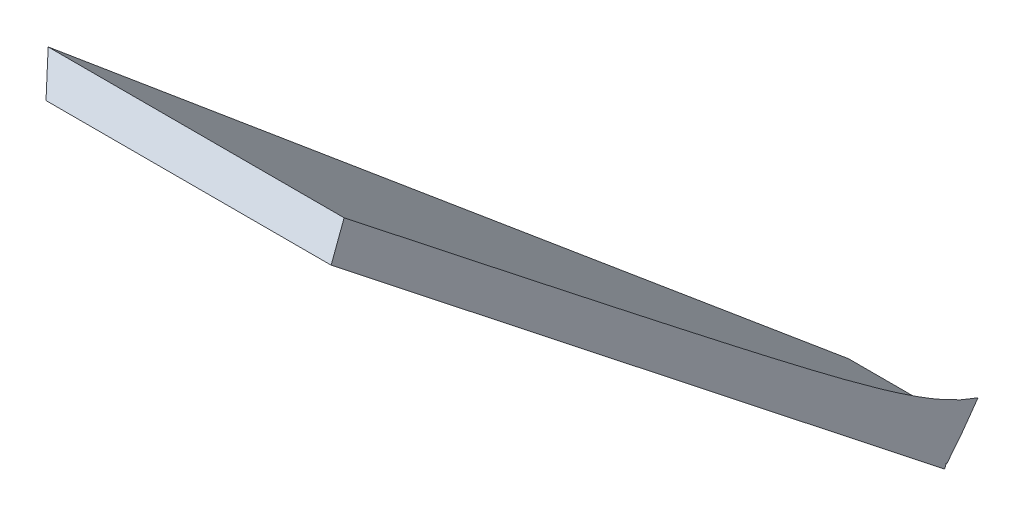
ISO-10303-21;
HEADER;
FILE_DESCRIPTION(('STEP AP214'),'2;1');
FILE_NAME('part.step','',(''),(''),'','','');
FILE_SCHEMA(('AUTOMOTIVE_DESIGN { 1 0 10303 214 1 1 1 1 }'));
ENDSEC;
DATA;
#1=APPLICATION_CONTEXT('core data for automotive mechanical design processes');
#2=APPLICATION_PROTOCOL_DEFINITION('international standard','automotive_design',2000,#1);
#3=PRODUCT_CONTEXT('',#1,'mechanical');
#4=PRODUCT('Part','Part','',(#3));
#5=PRODUCT_RELATED_PRODUCT_CATEGORY('part','',(#4));
#6=PRODUCT_DEFINITION_FORMATION('','',#4);
#7=PRODUCT_DEFINITION_CONTEXT('part definition',#1,'design');
#8=PRODUCT_DEFINITION('design','',#6,#7);
#9=PRODUCT_DEFINITION_SHAPE('','',#8);
#10=(LENGTH_UNIT() NAMED_UNIT(*) SI_UNIT(.MILLI.,.METRE.));
#11=(NAMED_UNIT(*) PLANE_ANGLE_UNIT() SI_UNIT($,.RADIAN.));
#12=(NAMED_UNIT(*) SI_UNIT($,.STERADIAN.) SOLID_ANGLE_UNIT());
#13=UNCERTAINTY_MEASURE_WITH_UNIT(LENGTH_MEASURE(1.E-05),#10,'distance_accuracy_value','');
#14=(GEOMETRIC_REPRESENTATION_CONTEXT(3) GLOBAL_UNCERTAINTY_ASSIGNED_CONTEXT((#13)) GLOBAL_UNIT_ASSIGNED_CONTEXT((#10,
#11,#12)) REPRESENTATION_CONTEXT('',''));
#15=CARTESIAN_POINT('',(0.,0.,0.));
#16=DIRECTION('',(0.,0.,1.));
#17=DIRECTION('',(1.,0.,0.));
#18=AXIS2_PLACEMENT_3D('',#15,#16,#17);
#19=CARTESIAN_POINT('',(-123.381202334399,324.271488093634,69.1234463208217));
#20=DIRECTION('',(0.843459103537485,0.255501074852039,-0.472541999624579));
#21=DIRECTION('',(-0.488764700454802,0.,-0.872415650701733));
#22=AXIS2_PLACEMENT_3D('',#19,#20,#21);
#23=PLANE('',#22);
#24=DIRECTION('',(-0.51330997527697,0.642705823376129,-0.568719697108839));
#25=VECTOR('',#24,1.);
#26=CARTESIAN_POINT('',(65.0027706220085,482.587615000697,490.978260708074));
#27=LINE('',#26,#25);
#28=CARTESIAN_POINT('',(161.595082833736,361.646186737307,597.997319736598));
#29=VERTEX_POINT('',#28);
#30=CARTESIAN_POINT('',(154.948455822144,369.968304155451,590.633216401593));
#31=VERTEX_POINT('',#30);
#32=EDGE_CURVE('E253',#29,#31,#27,.T.);
#33=ORIENTED_EDGE('',*,*,#32,.T.);
#34=DIRECTION('',(-0.213764834318812,-0.647368565890785,-0.731586314459996));
#35=VECTOR('',#34,1.);
#36=CARTESIAN_POINT('',(54.3487611073639,65.3107101967116,246.341976325958));
#37=LINE('',#36,#35);
#38=CARTESIAN_POINT('',(45.9145113102629,39.7683041554508,217.476696664976));
#39=VERTEX_POINT('',#38);
#40=EDGE_CURVE('E112',#31,#39,#37,.T.);
#41=ORIENTED_EDGE('',*,*,#40,.T.);
#42=DIRECTION('',(-0.51330997527697,0.642705823376129,-0.568719697108839));
#43=VECTOR('',#42,1.);
#44=CARTESIAN_POINT('',(29.5096667577666,60.3085033202547,199.301015937206));
#45=LINE('',#44,#43);
#46=CARTESIAN_POINT('',(52.5611383218553,31.4461867373069,224.84079999998));
#47=VERTEX_POINT('',#46);
#48=EDGE_CURVE('E260',#39,#47,#45,.F.);
#49=ORIENTED_EDGE('',*,*,#48,.T.);
#50=DIRECTION('',(-0.213764834318812,-0.647368565890785,-0.731586314459996));
#51=VECTOR('',#50,1.);
#52=CARTESIAN_POINT('',(60.6916678098232,56.0688017306996,252.666630762394));
#53=LINE('',#52,#51);
#54=EDGE_CURVE('E102',#29,#47,#53,.T.);
#55=ORIENTED_EDGE('',*,*,#54,.F.);
#56=EDGE_LOOP('',(#33,#41,#49,#55));
#57=FACE_BOUND('',#56,.T.);
#58=ADVANCED_FACE('F38',(#57),#23,.F.);
#59=CARTESIAN_POINT('',(-6.22609191666298,361.769121183095,2.73946802342179));
#60=DIRECTION('',(-0.915166256682498,0.0180699960866787,0.402671327351691));
#61=DIRECTION('',(0.402737084534614,0.,0.915315705503057));
#62=AXIS2_PLACEMENT_3D('',#59,#60,#61);
#63=PLANE('',#62);
#64=CARTESIAN_POINT('',(252.607877841035,369.968304155451,590.633216401593));
#65=DIRECTION('',(0.266763291800914,-0.721758487280029,0.638672085022341));
#66=VECTOR('',#65,1.);
#67=LINE('',#64,#66);
#68=CARTESIAN_POINT('',(252.607877841036,369.968304155451,590.633216401594));
#69=VERTEX_POINT('',#68);
#70=CARTESIAN_POINT('',(255.683748074746,361.646186737307,597.997319736598));
#71=VERTEX_POINT('',#70);
#72=EDGE_CURVE('E93',#69,#71,#67,.T.);
#73=ORIENTED_EDGE('',*,*,#72,.T.);
#74=DIRECTION('',(0.324104895832751,0.626915411174135,0.708472359185315));
#75=VECTOR('',#74,1.);
#76=CARTESIAN_POINT('',(91.5139467042197,44.0928888900743,239.132742342416));
#77=LINE('',#76,#75);
#78=CARTESIAN_POINT('',(84.9758109194033,31.4461867373069,224.84079999998));
#79=VERTEX_POINT('',#78);
#80=EDGE_CURVE('E255',#79,#71,#77,.T.);
#81=ORIENTED_EDGE('',*,*,#80,.F.);
#82=DIRECTION('',(0.266763291800911,-0.72175848728003,0.638672085022341));
#83=VECTOR('',#82,1.);
#84=CARTESIAN_POINT('',(76.4433510153192,54.5317293978966,204.412787133135));
#85=LINE('',#84,#83);
#86=CARTESIAN_POINT('',(84.572881591908,32.5362916286557,223.876128621561));
#87=VERTEX_POINT('',#86);
#88=EDGE_CURVE('E256',#79,#87,#85,.F.);
#89=ORIENTED_EDGE('',*,*,#88,.T.);
#90=CARTESIAN_POINT('',(85.0549295765274,33.7628232981962,224.916656187421));
#91=CARTESIAN_POINT('',(84.9568443758374,33.5143924299296,224.704882675522));
#92=CARTESIAN_POINT('',(84.8588871393099,33.265651210357,224.493413919692));
#93=CARTESIAN_POINT('',(84.66323548451,32.7675350057807,224.071102165369));
#94=CARTESIAN_POINT('',(84.565541066249,32.5181600207494,223.860259166903));
#95=CARTESIAN_POINT('',(84.2923974661289,31.8190638295863,223.270847593496));
#96=CARTESIAN_POINT('',(84.1172502516846,31.3686184764036,222.892997807561));
#97=CARTESIAN_POINT('',(83.9425599584571,30.9170875281886,222.516235200046));
#98=B_SPLINE_CURVE_WITH_KNOTS('',3,(#90,#91,#92,#93,#94,#95,#96,#97),.UNSPECIFIED.,.F.,.F.,(4,2,
2,4),(0.,1.02258449270982,2.04516902976666,3.88557836153574),.UNSPECIFIED.);
#99=CARTESIAN_POINT('',(84.3974829496179,32.0879287974742,223.497639591484));
#100=VERTEX_POINT('',#99);
#101=EDGE_CURVE('E265',#87,#100,#98,.T.);
#102=ORIENTED_EDGE('',*,*,#101,.T.);
#103=CARTESIAN_POINT('',(84.9822125687129,31.7704022715625,224.84079999998));
#104=CARTESIAN_POINT('',(84.2652422762924,32.1500654593654,223.194277176154));
#105=CARTESIAN_POINT('',(83.5517346550368,32.5634638073492,221.55411021981));
#106=CARTESIAN_POINT('',(82.1332336715688,33.4546729153,218.290236457361));
#107=CARTESIAN_POINT('',(81.4282307590856,33.9324022968673,216.666511597876));
#108=CARTESIAN_POINT('',(80.0229304469749,34.952791635781,213.426842495807));
#109=CARTESIAN_POINT('',(79.322675767781,35.4957722536853,211.810980955821));
#110=CARTESIAN_POINT('',(77.9302247318506,36.6427119152553,208.594835903031));
#111=CARTESIAN_POINT('',(77.2380396541252,37.2467470134385,206.994574611491));
#112=CARTESIAN_POINT('',(76.5506089116107,37.8796284871126,205.403824186521));
#113=B_SPLINE_CURVE_WITH_KNOTS('',3,(#103,#104,#105,#106,#107,#108,#109,#110,#111,#112),
.UNSPECIFIED.,.F.,.F.,(4,2,2,2,4),(0.,5.50620403271491,11.0055070580052,16.5330342474946,
22.0675338861274),.UNSPECIFIED.);
#114=CARTESIAN_POINT('',(76.5509766514666,37.8798220677374,205.404651276164));
#115=VERTEX_POINT('',#114);
#116=EDGE_CURVE('E97',#100,#115,#113,.T.);
#117=ORIENTED_EDGE('',*,*,#116,.T.);
#118=CARTESIAN_POINT('',(252.660470814629,370.070034632494,590.748181243401));
#119=CARTESIAN_POINT('',(250.455464817295,365.804896416015,585.928180608077));
#120=CARTESIAN_POINT('',(248.250426734534,361.5398624806,581.108102371354));
#121=CARTESIAN_POINT('',(243.840276059448,353.010036761755,571.467765690579));
#122=CARTESIAN_POINT('',(241.635163467122,348.745244978327,566.647507246526));
#123=CARTESIAN_POINT('',(237.224853449786,340.215937183471,557.006785180638));
#124=CARTESIAN_POINT('',(235.019656024775,335.951421172043,552.186321558804));
#125=CARTESIAN_POINT('',(230.609163515494,327.422706681706,542.545158111897));
#126=CARTESIAN_POINT('',(228.403868431223,323.158508202795,537.724458286826));
#127=CARTESIAN_POINT('',(223.993057843438,314.630270627772,528.082550529233));
#128=CARTESIAN_POINT('',(221.787542334418,310.366231549558,523.261342583399));
#129=CARTESIAN_POINT('',(217.376379866612,301.838580881307,513.618608757244));
#130=CARTESIAN_POINT('',(215.170732907825,297.57496929127,508.797082876923));
#131=CARTESIAN_POINT('',(210.759284973051,289.048247023974,499.153658596994));
#132=CARTESIAN_POINT('',(208.553483997063,284.785136346718,494.331760197384));
#133=CARTESIAN_POINT('',(204.14170026075,276.259506242119,484.687523717552));
#134=CARTESIAN_POINT('',(201.935717500422,271.996986814784,479.865185637322));
#135=CARTESIAN_POINT('',(197.523536371471,263.472652681133,470.219987831226));
#136=CARTESIAN_POINT('',(195.317338002907,259.210837974629,465.397128105499));
#137=CARTESIAN_POINT('',(190.904681863129,250.688053061476,455.750781202714));
#138=CARTESIAN_POINT('',(188.698224091917,246.427082854824,450.927294025659));
#139=CARTESIAN_POINT('',(184.284994366416,237.906165891374,441.279559688248));
#140=CARTESIAN_POINT('',(182.078222412136,233.646219134551,436.455312527911));
#141=CARTESIAN_POINT('',(177.66429390801,225.127578917922,426.805887880367));
#142=CARTESIAN_POINT('',(175.457137358173,220.868885458088,421.980710393181));
#143=CARTESIAN_POINT('',(171.042451427878,212.353250990596,412.32942943083));
#144=CARTESIAN_POINT('',(168.834922069754,208.096309910131,407.503326009693));
#145=CARTESIAN_POINT('',(164.419266004762,199.584376235877,397.84967411156));
#146=CARTESIAN_POINT('',(162.211139297886,195.329383642115,393.022125634544));
#147=CARTESIAN_POINT('',(157.794125255452,186.821880400319,383.365188593073));
#148=CARTESIAN_POINT('',(155.585237919789,182.569369752632,378.53580002836));
#149=CARTESIAN_POINT('',(151.166480456179,174.067555682236,368.874645344802));
#150=CARTESIAN_POINT('',(148.956610327799,169.818252260941,364.04287922491));
#151=CARTESIAN_POINT('',(145.640863267244,163.447540978023,356.792943857616));
#152=CARTESIAN_POINT('',(144.535472682387,161.324540759327,354.375951407537));
#153=CARTESIAN_POINT('',(142.324315083726,157.079775172932,349.541055568862));
#154=CARTESIAN_POINT('',(141.21854807001,154.958009804948,347.123152180477));
#155=CARTESIAN_POINT('',(139.006577448112,150.715916113335,342.286288651264));
#156=CARTESIAN_POINT('',(137.900373840295,148.59558778851,339.867328511319));
#157=CARTESIAN_POINT('',(135.687456260481,144.356614959386,335.028172745629));
#158=CARTESIAN_POINT('',(134.580742289148,142.237970452903,332.607977121494));
#159=CARTESIAN_POINT('',(132.366590317655,138.002429424244,327.765861904381));
#160=CARTESIAN_POINT('',(131.259152251228,135.885533120048,325.343942151015));
#161=CARTESIAN_POINT('',(129.043562153696,131.654090647833,320.49837452687));
#162=CARTESIAN_POINT('',(127.935410122283,129.53954448083,318.074726655344));
#163=CARTESIAN_POINT('',(125.71825172545,125.313256536575,313.225363387462));
#164=CARTESIAN_POINT('',(124.609245357572,123.201514767438,310.799647985157));
#165=CARTESIAN_POINT('',(122.390203452442,118.98140333445,305.945726824408));
#166=CARTESIAN_POINT('',(121.280167909088,116.873033690798,303.517521051187));
#167=CARTESIAN_POINT('',(119.283913166284,113.087219948977,299.150447407224));
#168=CARTESIAN_POINT('',(118.397919705713,111.409026257041,297.212126219958));
#169=CARTESIAN_POINT('',(116.625009807793,108.05572132754,293.333247835361));
#170=CARTESIAN_POINT('',(115.738093372244,106.38061008398,291.392690642391));
#171=CARTESIAN_POINT('',(113.963180037928,103.034045919622,287.508956478766));
#172=CARTESIAN_POINT('',(113.075183150484,101.362592960989,285.565779535544));
#173=CARTESIAN_POINT('',(111.297912961266,98.0240495115435,281.676328927243));
#174=CARTESIAN_POINT('',(110.408639681858,96.3569589457017,279.730055316362));
#175=CARTESIAN_POINT('',(108.628814593227,93.0284598252007,275.834347349901));
#176=CARTESIAN_POINT('',(107.738263237114,91.367049743198,273.884914092657));
#177=CARTESIAN_POINT('',(105.955309313905,88.0504818829457,269.981559687411));
#178=CARTESIAN_POINT('',(105.062906737537,86.3953241361295,268.027638516924));
#179=CARTESIAN_POINT('',(103.275840028819,83.0925588357623,264.114317435509));
#180=CARTESIAN_POINT('',(102.381175815363,81.4449515591164,262.154917327823));
#181=CARTESIAN_POINT('',(100.58907387438,78.1589271206093,258.229401233657));
#182=CARTESIAN_POINT('',(99.6916359428656,76.5205106608704,256.26328475206));
#183=CARTESIAN_POINT('',(98.1918842520484,73.7971139324413,252.976955970429));
#184=CARTESIAN_POINT('',(97.5904860930799,72.7089459078139,251.658967641181));
#185=CARTESIAN_POINT('',(96.3859858307554,70.5385427193834,249.018852125346));
#186=CARTESIAN_POINT('',(95.7828837024745,69.4563076430533,247.696724878186));
#187=CARTESIAN_POINT('',(94.5747545600541,67.2987724446748,245.047784415299));
#188=CARTESIAN_POINT('',(93.9697276143728,66.2234720800145,243.720971366047));
#189=CARTESIAN_POINT('',(92.7574804430895,64.0809775431069,241.061996750046));
#190=CARTESIAN_POINT('',(92.1502603869884,63.0137827633742,239.729835595788));
#191=CARTESIAN_POINT('',(90.9333037335963,60.8888672075956,237.059368700804));
#192=CARTESIAN_POINT('',(90.3235674009036,59.8311454707194,235.721063604556));
#193=CARTESIAN_POINT('',(89.1011898196953,57.726776694878,233.037354320337));
#194=CARTESIAN_POINT('',(88.4885488976155,56.6801284522175,231.691950928284));
#195=CARTESIAN_POINT('',(87.2591905743576,54.5985826947396,228.99135205953));
#196=CARTESIAN_POINT('',(86.6424695356724,53.5636988358729,227.636147702916));
#197=CARTESIAN_POINT('',(85.405086980354,51.5090918874845,224.916102973331));
#198=CARTESIAN_POINT('',(84.7844255221005,50.489368574094,223.551262743089));
#199=CARTESIAN_POINT('',(83.538527449556,48.467678623066,220.810387317432));
#200=CARTESIAN_POINT('',(82.9132905356514,47.4657131632317,219.434351388219));
#201=CARTESIAN_POINT('',(81.6575055312566,45.4825564222407,216.669276371719));
#202=CARTESIAN_POINT('',(81.0269563578638,44.5013695273999,215.280234626441));
#203=CARTESIAN_POINT('',(79.7596924500353,42.5632241829026,212.487051174908));
#204=CARTESIAN_POINT('',(79.1229751225894,41.6062765937276,211.082903088053));
#205=CARTESIAN_POINT('',(78.162694286581,40.1921857500359,208.963894496968));
#206=CARTESIAN_POINT('',(77.8416042831691,39.7241950952155,208.255142401167));
#207=CARTESIAN_POINT('',(77.1976724718567,38.7960381674455,206.833305696204));
#208=CARTESIAN_POINT('',(76.8748306344671,38.3358720267508,206.120221014085));
#209=CARTESIAN_POINT('',(76.5510686541073,37.8799147545906,205.40485621423));
#210=B_SPLINE_CURVE_WITH_KNOTS('',3,(#118,#119,#120,#121,#122,#123,#124,#125,#126,#127,#128,
#129,#130,#131,#132,#133,#134,#135,#136,#137,#138,#139,#140,#141,#142,#143,#144,#145,#146,#147,
#148,#149,#150,#151,#152,#153,#154,#155,#156,#157,#158,#159,#160,#161,#162,#163,#164,#165,#166,
#167,#168,#169,#170,#171,#172,#173,#174,#175,#176,#177,#178,#179,#180,#181,#182,#183,#184,#185,
#186,#187,#188,#189,#190,#191,#192,#193,#194,#195,#196,#197,#198,#199,#200,#201,#202,#203,#204,
#205,#206,#207,#208,#209),.UNSPECIFIED.,.F.,.F.,(4,2,2,2,2,2,2,2,2,2,2,2,2,2,2,2,2,2,2,2,2,2,2,
2,2,2,2,2,2,2,2,2,2,2,2,2,2,2,2,2,2,2,2,2,2,4),(0.,20.4101140192597,40.8202281152393,
61.2303422203503,81.6404562902559,102.051565153618,122.462674039707,142.87378306066,
163.284892419805,183.695996334394,204.107100167581,224.518203499165,244.929306377516,
265.339452205527,285.749598314205,306.159747275467,326.569905225301,336.774699738519,
346.979491900997,357.184275552171,367.389045943735,377.594939163817,387.800836796681,
398.006763897419,408.212751905308,416.350665006011,424.488562262631,432.626374954806,
440.764046750744,448.899324463151,457.034643020831,465.170257582231,473.306485414557,
478.742090952479,484.177776416413,489.613270669073,495.048353448858,500.482878570664,
505.916806758396,511.356504308613,516.796121453402,522.236098044885,527.677211782932,
533.120721781166,535.844647338766,538.568618892218),.UNSPECIFIED.);
#211=EDGE_CURVE('E89',#69,#115,#210,.T.);
#212=ORIENTED_EDGE('',*,*,#211,.F.);
#213=EDGE_LOOP('',(#73,#81,#89,#102,#117,#212));
#214=FACE_BOUND('',#213,.T.);
#215=ADVANCED_FACE('F91',(#214),#63,.F.);
#216=CARTESIAN_POINT('',(-34.9249999999667,31.4461867373069,224.84079999998));
#217=DIRECTION('',(0.,0.662686464342369,0.748896955513514));
#218=DIRECTION('',(1.,0.,0.));
#219=AXIS2_PLACEMENT_3D('',#216,#217,#218);
#220=PLANE('',#219);
#221=ORIENTED_EDGE('',*,*,#88,.F.);
#222=DIRECTION('',(1.,0.,0.));
#223=VECTOR('',#222,1.);
#224=CARTESIAN_POINT('',(-34.9249999999667,31.4461867373069,224.84079999998));
#225=LINE('',#224,#223);
#226=EDGE_CURVE('E267',#47,#79,#225,.T.);
#227=ORIENTED_EDGE('',*,*,#226,.F.);
#228=ORIENTED_EDGE('',*,*,#48,.F.);
#229=DIRECTION('',(1.,0.,0.));
#230=VECTOR('',#229,1.);
#231=CARTESIAN_POINT('',(0.,39.7683041554508,217.476696664976));
#232=LINE('',#231,#230);
#233=CARTESIAN_POINT('',(77.6806174921059,39.7683041554563,217.476696664982));
#234=VERTEX_POINT('',#233);
#235=EDGE_CURVE('E54',#39,#234,#232,.T.);
#236=ORIENTED_EDGE('',*,*,#235,.T.);
#237=CARTESIAN_POINT('',(84.57294976445,32.5363004233152,223.876065154538));
#238=CARTESIAN_POINT('',(84.2858236139581,32.837621200298,223.609405319659));
#239=CARTESIAN_POINT('',(83.9986927057303,33.1389413635038,223.342749914121));
#240=CARTESIAN_POINT('',(83.4244165910765,33.7415855303322,222.8094434429));
#241=CARTESIAN_POINT('',(83.1372713844913,34.0429095339343,222.542792377365));
#242=CARTESIAN_POINT('',(82.5629667351474,34.6455613648957,222.009494567325));
#243=CARTESIAN_POINT('',(82.2758072922309,34.9468891922348,221.742847822966));
#244=CARTESIAN_POINT('',(81.7014742322466,35.549548654011,221.209558636453));
#245=CARTESIAN_POINT('',(81.4143006150223,35.8508802884279,220.942916194445));
#246=CARTESIAN_POINT('',(80.8399392684451,36.4535473477009,220.409635593807));
#247=CARTESIAN_POINT('',(80.5527515389372,36.7548827725368,220.142997435322));
#248=CARTESIAN_POINT('',(79.9783620298152,37.3575573959883,219.609725382907));
#249=CARTESIAN_POINT('',(79.6911602500476,37.6588965945841,219.34309148912));
#250=CARTESIAN_POINT('',(79.1167427024294,38.2615787488962,218.809827947275));
#251=CARTESIAN_POINT('',(78.8295269344265,38.5629217045928,218.543198299358));
#252=CARTESIAN_POINT('',(78.2550814723587,39.1656113564476,218.009943230431));
#253=CARTESIAN_POINT('',(77.9678517781427,39.4669580525863,217.743317809561));
#254=CARTESIAN_POINT('',(77.6806174921062,39.7683041554561,217.476696664982));
#255=B_SPLINE_CURVE_WITH_KNOTS('',3,(#237,#238,#239,#240,#241,#242,#243,#244,#245,#246,#247,
#248,#249,#250,#251,#252,#253,#254),.UNSPECIFIED.,.F.,.F.,(4,2,2,2,2,2,2,2,4),(0.,
1.48293221023283,2.9658893369077,4.44887127296019,5.93187791131262,7.41490914487391,
8.89796486653992,10.3810449691932,11.8641493457032),.UNSPECIFIED.);
#256=EDGE_CURVE('E101',#234,#87,#255,.F.);
#257=ORIENTED_EDGE('',*,*,#256,.T.);
#258=EDGE_LOOP('',(#221,#227,#228,#236,#257));
#259=FACE_BOUND('',#258,.T.);
#260=ADVANCED_FACE('F150',(#259),#220,.F.);
#261=CARTESIAN_POINT('',(-204.997061337424,361.646186737307,597.997319736598));
#262=DIRECTION('',(0.,0.662686464342369,0.748896955513514));
#263=DIRECTION('',(1.,0.,0.));
#264=AXIS2_PLACEMENT_3D('',#261,#262,#263);
#265=PLANE('',#264);
#266=ORIENTED_EDGE('',*,*,#32,.F.);
#267=DIRECTION('',(1.,0.,0.));
#268=VECTOR('',#267,1.);
#269=CARTESIAN_POINT('',(-204.997061337424,361.646186737307,597.997319736598));
#270=LINE('',#269,#268);
#271=EDGE_CURVE('E111',#29,#71,#270,.T.);
#272=ORIENTED_EDGE('',*,*,#271,.T.);
#273=ORIENTED_EDGE('',*,*,#72,.F.);
#274=DIRECTION('',(1.,0.,0.));
#275=VECTOR('',#274,1.);
#276=CARTESIAN_POINT('',(0.,369.968304155451,590.633216401593));
#277=LINE('',#276,#275);
#278=EDGE_CURVE('E47',#31,#69,#277,.T.);
#279=ORIENTED_EDGE('',*,*,#278,.F.);
#280=EDGE_LOOP('',(#266,#272,#273,#279));
#281=FACE_BOUND('',#280,.T.);
#282=ADVANCED_FACE('F108',(#281),#265,.T.);
#283=CARTESIAN_POINT('',(77.6806174921059,39.7683041554563,217.476696664982));
#284=CARTESIAN_POINT('',(77.1745075386594,38.9389690222923,216.539471310691));
#285=CARTESIAN_POINT('',(76.6660476196011,38.1102650665034,215.602959245173));
#286=CARTESIAN_POINT('',(76.1550441704827,37.2822442775744,214.66721922135));
#287=CARTESIAN_POINT('',(76.1499341359915,37.2739640696851,214.657861821112));
#288=CARTESIAN_POINT('',(76.1448241015003,37.2656838617958,214.648504420873));
#289=CARTESIAN_POINT('',(76.1397140670091,37.2574036539065,214.639147020635));
#290=B_SPLINE_CURVE_WITH_KNOTS('',3,(#283,#284,#285,#286,#287,#288,#289),.UNSPECIFIED.,.F.,.F.,
(4,3,4),(0.,1.,1.01),.UNSPECIFIED.);
#291=DIRECTION('',(-0.610722370638425,0.497359138585639,-0.61615912982535));
#292=VECTOR('',#291,1.);
#293=SURFACE_OF_LINEAR_EXTRUSION('',#290,#292);
#294=ORIENTED_EDGE('',*,*,#101,.F.);
#295=ORIENTED_EDGE('',*,*,#256,.F.);
#296=CARTESIAN_POINT('',(76.1550441706473,37.282244277841,214.66721922135));
#297=CARTESIAN_POINT('',(76.2184022327215,37.3849085433734,214.783239322252));
#298=CARTESIAN_POINT('',(76.2817212369966,37.4875834120271,214.899271369284));
#299=CARTESIAN_POINT('',(76.4084294938161,37.6931936760983,215.131629850606));
#300=CARTESIAN_POINT('',(76.471818565605,37.7961291204709,215.247956340145));
#301=CARTESIAN_POINT('',(76.5986671201759,38.0022603850196,215.48090357682));
#302=CARTESIAN_POINT('',(76.6621264235288,38.1054562536748,215.597524378763));
#303=CARTESIAN_POINT('',(76.7891156052984,38.3121082173469,215.831060107066));
#304=CARTESIAN_POINT('',(76.8526453056084,38.4155643603764,215.947975087789));
#305=CARTESIAN_POINT('',(76.9797754561487,38.6227367348984,216.182099020544));
#306=CARTESIAN_POINT('',(77.0433757296141,38.7264530139715,216.299308026456));
#307=CARTESIAN_POINT('',(77.1706472064056,38.9341455264115,216.534019847959));
#308=CARTESIAN_POINT('',(77.2343182343138,39.0381218069419,216.651522716935));
#309=CARTESIAN_POINT('',(77.3617314031996,39.2463341876715,216.886822098231));
#310=CARTESIAN_POINT('',(77.4254733701074,39.3505703346228,217.004618663438));
#311=CARTESIAN_POINT('',(77.5530286136025,39.5593023323282,217.240505244748));
#312=CARTESIAN_POINT('',(77.6168417174923,39.6637982294723,217.358595313187));
#313=CARTESIAN_POINT('',(77.6806174921161,39.768304155465,217.476696664774));
#314=B_SPLINE_CURVE_WITH_KNOTS('',3,(#296,#297,#298,#299,#300,#301,#302,#303,#304,#305,#306,
#307,#308,#309,#310,#311,#312,#313),.UNSPECIFIED.,.F.,.F.,(4,2,2,2,2,2,2,2,4),(0.,
0.502129193893125,1.00542986904263,1.50990178769605,2.01554470624765,2.52235837147836,
3.03034252299635,3.53949689183439,4.04982120143442),.UNSPECIFIED.);
#315=CARTESIAN_POINT('',(76.1550441704827,37.2822442775744,214.66721922135));
#316=VERTEX_POINT('',#315);
#317=EDGE_CURVE('E118',#316,#234,#314,.T.);
#318=ORIENTED_EDGE('',*,*,#317,.F.);
#319=CARTESIAN_POINT('',(76.1549375324073,37.2815591312126,214.666850913674));
#320=CARTESIAN_POINT('',(76.5020727146684,37.0330543919988,215.028624870082));
#321=CARTESIAN_POINT('',(76.8497209652519,36.7878438916213,215.392172668075));
#322=CARTESIAN_POINT('',(77.5438309441613,36.3056861203354,216.120545498457));
#323=CARTESIAN_POINT('',(77.8902866345251,36.0686969918886,216.485348580208));
#324=CARTESIAN_POINT('',(78.5820086731018,35.6029820738574,217.216233017085));
#325=CARTESIAN_POINT('',(78.9272695014769,35.3742149040999,217.582293221133));
#326=CARTESIAN_POINT('',(79.6165973497662,34.924944480253,218.315691978157));
#327=CARTESIAN_POINT('',(79.960659374968,34.7044003945204,218.683010208137));
#328=CARTESIAN_POINT('',(80.6475849900864,34.2715766692376,219.418925532043));
#329=CARTESIAN_POINT('',(80.9904441061396,34.0592568230634,219.787503149361));
#330=CARTESIAN_POINT('',(81.6749586390401,33.6428821666636,220.525937717093));
#331=CARTESIAN_POINT('',(82.0166100990342,33.4387878526932,220.895776056561));
#332=CARTESIAN_POINT('',(82.6987039195149,33.0388649678312,221.636733031762));
#333=CARTESIAN_POINT('',(83.0391428310509,32.8429976754081,222.0078339364));
#334=CARTESIAN_POINT('',(83.7188045778533,32.4595292952759,222.751315826693));
#335=CARTESIAN_POINT('',(84.0580244680658,32.2718903510502,223.123679981941));
#336=CARTESIAN_POINT('',(84.397490448743,32.0879215315775,223.497629208775));
#337=B_SPLINE_CURVE_WITH_KNOTS('',3,(#319,#320,#321,#322,#323,#324,#325,#326,#327,#328,#329,
#330,#331,#332,#333,#334,#335,#336),.UNSPECIFIED.,.F.,.F.,(4,2,2,2,2,2,2,2,4),(0.,
1.67875197626788,3.34707915832846,5.00529397707592,6.65371402324742,8.29266204254604,
9.92246592173046,11.5434586649116,13.1559783594887),.UNSPECIFIED.);
#338=EDGE_CURVE('E269',#316,#100,#337,.T.);
#339=ORIENTED_EDGE('',*,*,#338,.T.);
#340=EDGE_LOOP('',(#294,#295,#318,#339));
#341=FACE_BOUND('',#340,.T.);
#342=ADVANCED_FACE('F175',(#341),#293,.F.);
#343=CARTESIAN_POINT('',(85.7104778066998,31.3953036336931,224.84079999998));
#344=CARTESIAN_POINT('',(85.7066358554148,31.3878443702238,215.319611182266));
#345=CARTESIAN_POINT('',(85.7024328717195,31.3817222268896,205.798420188865));
#346=CARTESIAN_POINT('',(85.6983904559327,31.3766796815384,196.277230001507));
#347=CARTESIAN_POINT('',(85.6116867373077,31.4461867373069,224.84079999998));
#348=CARTESIAN_POINT('',(85.6116867373077,31.4461867373069,215.319610000489));
#349=CARTESIAN_POINT('',(85.6116867373077,31.4461867373069,205.798420000998));
#350=CARTESIAN_POINT('',(85.6116867373077,31.4461867373069,196.277230001507));
#351=CARTESIAN_POINT('',(75.7325797980967,36.5344970986776,224.84079999998));
#352=CARTESIAN_POINT('',(76.1167749265944,37.2804234456172,215.319491822811));
#353=CARTESIAN_POINT('',(76.5370732961312,37.8926377790306,205.798401214307));
#354=CARTESIAN_POINT('',(76.9413148748088,38.3968923141521,196.277230001507));
#355=B_SPLINE_SURFACE_WITH_KNOTS('',1,3,((#343,#344,#345,#346),(#347,#348,#349,#350),(#351,#352,
#353,#354)),.UNSPECIFIED.,.F.,.F.,.F.,(2,1,2),(4,4),(-0.01,0.,1.),(-0.0142817849992367,
0.0142817849992367),.UNSPECIFIED.);
#356=CARTESIAN_POINT('',(76.1546952403434,37.2816788012824,214.66716560405));
#357=CARTESIAN_POINT('',(76.1710377860309,37.3081881772476,214.281229902857));
#358=CARTESIAN_POINT('',(76.1874096971903,37.3344938585911,213.895281458561));
#359=CARTESIAN_POINT('',(76.2202042126601,37.3866994333411,213.123384894583));
#360=CARTESIAN_POINT('',(76.2366268135562,37.4125993533946,212.737436776558));
#361=CARTESIAN_POINT('',(76.2695157604853,37.4639968341172,211.965540828158));
#362=CARTESIAN_POINT('',(76.2859821036092,37.4894944207983,211.57959299939));
#363=CARTESIAN_POINT('',(76.3189515863,37.5400906643875,210.807697589002));
#364=CARTESIAN_POINT('',(76.3354547234475,37.5651893466929,210.421750008943));
#365=CARTESIAN_POINT('',(76.3684908456536,37.6149912108419,209.649855056464));
#366=CARTESIAN_POINT('',(76.3850238287677,37.6396944174873,209.263907685561));
#367=CARTESIAN_POINT('',(76.4181126942628,37.6887087597657,208.492013111432));
#368=CARTESIAN_POINT('',(76.4346685751598,37.7130199196232,208.106065909679));
#369=CARTESIAN_POINT('',(76.4677962877169,37.7612535975254,207.334171634701));
#370=CARTESIAN_POINT('',(76.4843681183402,37.7851761392351,206.94822456291));
#371=CARTESIAN_POINT('',(76.517520781245,37.8326360109083,206.176330505888));
#372=CARTESIAN_POINT('',(76.5341016129241,37.8561733639945,205.790383522053));
#373=CARTESIAN_POINT('',(76.5506839644641,37.8795205180963,205.404425101961));
#374=B_SPLINE_CURVE_WITH_KNOTS('',3,(#356,#357,#358,#359,#360,#361,#362,#363,#364,#365,#366,
#367,#368,#369,#370,#371,#372,#373),.UNSPECIFIED.,.F.,.F.,(4,2,2,2,2,2,2,2,4),(0.,
1.1615703066353,2.32306400856365,3.48448230601108,4.64582636029897,5.80709729522642,
6.96829619845256,8.12942412288056,9.29048208804199),.UNSPECIFIED.);
#375=EDGE_CURVE('E125',#316,#115,#374,.T.);
#376=ORIENTED_EDGE('',*,*,#116,.F.);
#377=ORIENTED_EDGE('',*,*,#338,.F.);
#378=ORIENTED_EDGE('',*,*,#375,.T.);
#379=EDGE_LOOP('',(#376,#377,#378));
#380=FACE_BOUND('',#379,.T.);
#381=ADVANCED_FACE('F181',(#380),#355,.T.);
#382=CARTESIAN_POINT('',(0.,73.1918767145628,255.248422931852));
#383=DIRECTION('',(0.,0.748896955513514,-0.662686464342369));
#384=DIRECTION('',(0.,0.662686464342369,0.748896955513514));
#385=AXIS2_PLACEMENT_3D('',#382,#383,#384);
#386=PLANE('',#385);
#387=ORIENTED_EDGE('',*,*,#40,.F.);
#388=ORIENTED_EDGE('',*,*,#278,.T.);
#389=CARTESIAN_POINT('',(273.449328338625,410.296632879786,636.207955328205));
#390=CARTESIAN_POINT('',(270.511109595823,404.609286328078,629.780728054519));
#391=CARTESIAN_POINT('',(267.572564408484,398.922013832084,623.353584470633));
#392=CARTESIAN_POINT('',(261.694717804782,387.547640080637,610.499490820501));
#393=CARTESIAN_POINT('',(258.755416388374,381.860538825195,604.072540754267));
#394=CARTESIAN_POINT('',(252.875954259067,370.486531211545,591.218860873687));
#395=CARTESIAN_POINT('',(249.935793546146,364.799624853341,584.792131059347));
#396=CARTESIAN_POINT('',(244.054421731174,353.425915987126,571.938788790981));
#397=CARTESIAN_POINT('',(241.113210608181,347.73911348387,565.51217634233));
#398=CARTESIAN_POINT('',(235.229646658161,336.365767995948,552.659244725022));
#399=CARTESIAN_POINT('',(232.287293831161,330.679225011277,546.232925556359));
#400=CARTESIAN_POINT('',(226.401257262291,319.306441783341,533.380629344803));
#401=CARTESIAN_POINT('',(223.457573520472,313.620201540064,526.954652301897));
#402=CARTESIAN_POINT('',(216.096413324129,299.405035531931,510.890200832869));
#403=CARTESIAN_POINT('',(211.677963530101,290.876331093629,501.251976526209));
#404=CARTESIAN_POINT('',(202.836543134028,273.81994991006,481.976689301007));
#405=CARTESIAN_POINT('',(198.41357253136,265.292273164935,472.339626382625));
#406=CARTESIAN_POINT('',(189.561737586971,248.238458178741,453.067239197646));
#407=CARTESIAN_POINT('',(185.132873367748,239.712319909753,443.431914899497));
#408=CARTESIAN_POINT('',(176.26703492303,222.661899033207,424.16336337213));
#409=CARTESIAN_POINT('',(171.830060701259,214.1376164248,414.530136141953));
#410=CARTESIAN_POINT('',(165.166038220657,201.353232201854,400.082600334532));
#411=CARTESIAN_POINT('',(162.943289200467,197.092146445972,395.267179586609));
#412=CARTESIAN_POINT('',(158.494316133742,188.570771749046,385.637238565178));
#413=CARTESIAN_POINT('',(156.268092087324,184.310482807976,380.82271829164));
#414=CARTESIAN_POINT('',(151.811416068584,175.790866693906,371.194764631379));
#415=CARTESIAN_POINT('',(149.580964087984,171.531539522808,366.381331246804));
#416=CARTESIAN_POINT('',(145.11485183529,163.014084639967,356.75581997759));
#417=CARTESIAN_POINT('',(142.879191563593,158.755956928133,351.943742092848));
#418=CARTESIAN_POINT('',(138.401206506627,150.240909468489,342.320951434359));
#419=CARTESIAN_POINT('',(136.15888127039,145.9839898248,337.510238778279));
#420=CARTESIAN_POINT('',(131.665959527937,137.472065635258,327.890977703684));
#421=CARTESIAN_POINT('',(129.41536301873,133.217061090099,323.082429285952));
#422=CARTESIAN_POINT('',(124.903504184553,124.70955124511,313.468156828711));
#423=CARTESIAN_POINT('',(122.642241897538,120.457045936446,308.662432779218));
#424=CARTESIAN_POINT('',(119.239762973937,114.080770330012,301.456651997332));
#425=CARTESIAN_POINT('',(118.103839471126,111.955759574596,299.055193433147));
#426=CARTESIAN_POINT('',(115.827888253149,107.706703626507,294.253367479922));
#427=CARTESIAN_POINT('',(114.687860538652,105.582658433677,291.853000090705));
#428=CARTESIAN_POINT('',(112.402912753335,101.335473834595,287.053288934822));
#429=CARTESIAN_POINT('',(111.257992184265,99.2123345460324,284.653945301157));
#430=CARTESIAN_POINT('',(108.962558156408,94.9673824321423,279.856757059886));
#431=CARTESIAN_POINT('',(107.81204469463,92.8455696075252,277.458912453082));
#432=CARTESIAN_POINT('',(105.504427021975,88.6035128403307,272.664996221188));
#433=CARTESIAN_POINT('',(104.34732279724,86.4832689010624,270.268924599837));
#434=CARTESIAN_POINT('',(102.025297566171,82.244646676261,265.478889718295));
#435=CARTESIAN_POINT('',(100.860376514047,80.1262684017388,263.084926470547));
#436=CARTESIAN_POINT('',(98.5213935848697,75.892085166927,258.29990805798));
#437=CARTESIAN_POINT('',(97.3473330927666,73.7762798708365,255.908852513676));
#438=CARTESIAN_POINT('',(94.9880422691976,69.5474057122749,251.129833847979));
#439=CARTESIAN_POINT('',(93.8028119459668,67.4343368477876,248.741870724309));
#440=CARTESIAN_POINT('',(91.4188830898389,63.2115505091395,243.9697318578));
#441=CARTESIAN_POINT('',(90.2201846379272,61.1018330149135,241.585556092286));
#442=CARTESIAN_POINT('',(87.806463826506,56.8864980603237,236.821837978479));
#443=CARTESIAN_POINT('',(86.5914414784365,54.7808805970879,234.442295626941));
#444=CARTESIAN_POINT('',(84.7539398334884,51.6261602640125,230.87717006597));
#445=CARTESIAN_POINT('',(84.138912489405,50.5751503487826,229.689431718981));
#446=CARTESIAN_POINT('',(82.9033622738649,48.4745514870791,227.315560851034));
#447=CARTESIAN_POINT('',(82.2828394124168,47.4249625380215,226.129428327157));
#448=CARTESIAN_POINT('',(81.0357340455643,45.3273760322445,223.758961699833));
#449=CARTESIAN_POINT('',(80.4091515890611,44.2793784627612,222.574627581963));
#450=CARTESIAN_POINT('',(79.1492974766468,42.1851617631766,220.207969147101));
#451=CARTESIAN_POINT('',(78.516025886731,41.1389426156472,219.025644810415));
#452=CARTESIAN_POINT('',(77.2419698903726,39.04827452411,216.662996630638));
#453=CARTESIAN_POINT('',(76.6011840287346,38.0038259693592,215.482673227443));
#454=CARTESIAN_POINT('',(75.311459099907,35.9171351902604,213.124519778337));
#455=CARTESIAN_POINT('',(74.66251999409,34.8748929763927,211.946689744268));
#456=CARTESIAN_POINT('',(73.3556540770902,32.7928569100279,209.593796550777));
#457=CARTESIAN_POINT('',(72.6977270663357,31.7530631124996,208.418733453474));
#458=CARTESIAN_POINT('',(71.3719559883192,29.6761958838453,206.071681524341));
#459=CARTESIAN_POINT('',(70.7041114326475,28.6391225896752,204.899692847284));
#460=CARTESIAN_POINT('',(70.0308688038077,27.6035853183276,203.729440017988));
#461=B_SPLINE_CURVE_WITH_KNOTS('',3,(#389,#390,#391,#392,#393,#394,#395,#396,#397,#398,#399,
#400,#401,#402,#403,#404,#405,#406,#407,#408,#409,#410,#411,#412,#413,#414,#415,#416,#417,#418,
#419,#420,#421,#422,#423,#424,#425,#426,#427,#428,#429,#430,#431,#432,#433,#434,#435,#436,#437,
#438,#439,#440,#441,#442,#443,#444,#445,#446,#447,#448,#449,#450,#451,#452,#453,#454,#455,#456,
#457,#458,#459,#460),.UNSPECIFIED.,.F.,.F.,(4,2,2,2,2,2,2,2,2,2,2,2,2,2,2,2,2,2,2,2,2,2,2,2,2,2,
2,2,2,2,2,2,2,2,2,4),(0.,27.2138680808898,54.4277377788824,81.6416081867035,108.856055354605,
136.070501860762,163.284947317278,204.10665403808,244.928366389553,285.749243124534,
326.570101117734,346.98018800451,367.390274198357,387.800400393448,408.210525037243,
428.622063637518,449.033609621842,469.445083025317,479.65081280106,489.856540912903,
500.063334312928,510.270133173719,520.476953502189,530.683833671881,540.889196131169,
551.094551067019,561.299844669795,571.505131120938,576.608300806961,581.711461200832,
586.81458044621,591.917649390879,597.021723462564,602.125821724847,607.230033505746,
612.334497493058),.UNSPECIFIED.);
#462=EDGE_CURVE('E11',#234,#69,#461,.F.);
#463=ORIENTED_EDGE('',*,*,#462,.F.);
#464=ORIENTED_EDGE('',*,*,#235,.F.);
#465=EDGE_LOOP('',(#387,#388,#463,#464));
#466=FACE_BOUND('',#465,.T.);
#467=ADVANCED_FACE('F121',(#466),#386,.T.);
#468=CARTESIAN_POINT('',(85.6116867373077,31.4461867373069,224.84079999998));
#469=CARTESIAN_POINT('',(255.683748074746,361.646186737307,597.997319736598));
#470=CARTESIAN_POINT('',(85.6116867373077,31.4461867373069,220.080205000235));
#471=CARTESIAN_POINT('',(271.456523438741,361.646186737307,582.053901733105));
#472=CARTESIAN_POINT('',(85.6116867373077,31.4461867373069,215.319610000489));
#473=CARTESIAN_POINT('',(287.229298802736,361.646186737307,566.110483729611));
#474=CARTESIAN_POINT('',(85.6116867373077,31.4461867373069,205.798420000998));
#475=CARTESIAN_POINT('',(318.774849530726,361.646186737307,534.223647722625));
#476=CARTESIAN_POINT('',(85.6116867373077,31.4461867373069,201.037825001252));
#477=CARTESIAN_POINT('',(334.547624894721,361.646186737307,518.280229719132));
#478=CARTESIAN_POINT('',(85.6116867373077,31.4461867373069,196.277230001507));
#479=CARTESIAN_POINT('',(350.320400258716,361.646186737307,502.336811715639));
#480=B_SPLINE_SURFACE_WITH_KNOTS('',3,1,((#468,#469),(#470,#471),(#472,#473),(#474,#475),(#476,
#477),(#478,#479)),.UNSPECIFIED.,.F.,.F.,.F.,(4,2,4),(2,2),(0.,0.5,1.),(0.,1.),.UNSPECIFIED.);
#481=OFFSET_SURFACE('',#480,-11.1125,.F.);
#482=ORIENTED_EDGE('',*,*,#462,.T.);
#483=ORIENTED_EDGE('',*,*,#211,.T.);
#484=ORIENTED_EDGE('',*,*,#375,.F.);
#485=ORIENTED_EDGE('',*,*,#317,.T.);
#486=EDGE_LOOP('',(#482,#483,#484,#485));
#487=FACE_BOUND('',#486,.T.);
#488=ADVANCED_FACE('F116',(#487),#481,.F.);
#489=CARTESIAN_POINT('',(0.,64.8697592964189,262.612526266856));
#490=DIRECTION('',(0.,0.748896955513514,-0.662686464342369));
#491=DIRECTION('',(0.,0.662686464342369,0.748896955513514));
#492=AXIS2_PLACEMENT_3D('',#489,#490,#491);
#493=PLANE('',#492);
#494=ORIENTED_EDGE('',*,*,#226,.T.);
#495=ORIENTED_EDGE('',*,*,#80,.T.);
#496=ORIENTED_EDGE('',*,*,#271,.F.);
#497=ORIENTED_EDGE('',*,*,#54,.T.);
#498=EDGE_LOOP('',(#494,#495,#496,#497));
#499=FACE_BOUND('',#498,.T.);
#500=ADVANCED_FACE('F151',(#499),#493,.F.);
#501=CLOSED_SHELL('',(#58,#215,#260,#282,#342,#381,#467,#488,#500));
#502=MANIFOLD_SOLID_BREP('B2',#501);
#503=ADVANCED_BREP_SHAPE_REPRESENTATION('',(#18,#502),#14);
#504=SHAPE_DEFINITION_REPRESENTATION(#9,#503);
ENDSEC;
END-ISO-10303-21;
